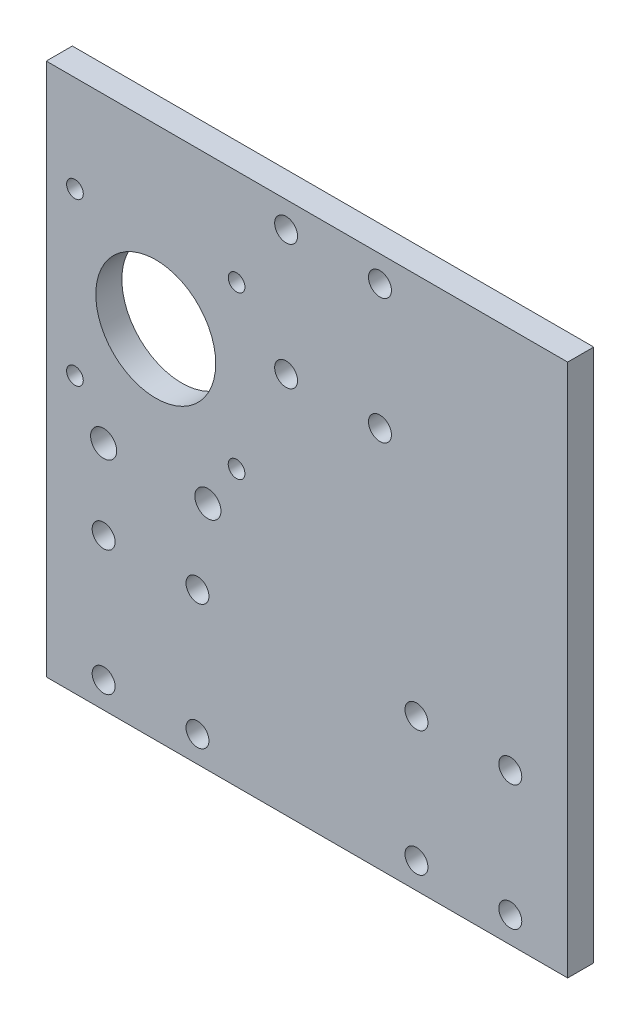
ISO-10303-21;
HEADER;
FILE_DESCRIPTION(('STEP AP214'),'2;1');
FILE_NAME('part.step','',(''),(''),'','','');
FILE_SCHEMA(('AUTOMOTIVE_DESIGN { 1 0 10303 214 1 1 1 1 }'));
ENDSEC;
DATA;
#1=APPLICATION_CONTEXT('core data for automotive mechanical design processes');
#2=APPLICATION_PROTOCOL_DEFINITION('international standard','automotive_design',2000,#1);
#3=PRODUCT_CONTEXT('',#1,'mechanical');
#4=PRODUCT('Part','Part','',(#3));
#5=PRODUCT_RELATED_PRODUCT_CATEGORY('part','',(#4));
#6=PRODUCT_DEFINITION_FORMATION('','',#4);
#7=PRODUCT_DEFINITION_CONTEXT('part definition',#1,'design');
#8=PRODUCT_DEFINITION('design','',#6,#7);
#9=PRODUCT_DEFINITION_SHAPE('','',#8);
#10=(LENGTH_UNIT() NAMED_UNIT(*) SI_UNIT(.MILLI.,.METRE.));
#11=(NAMED_UNIT(*) PLANE_ANGLE_UNIT() SI_UNIT($,.RADIAN.));
#12=(NAMED_UNIT(*) SI_UNIT($,.STERADIAN.) SOLID_ANGLE_UNIT());
#13=UNCERTAINTY_MEASURE_WITH_UNIT(LENGTH_MEASURE(1.E-05),#10,'distance_accuracy_value','');
#14=(GEOMETRIC_REPRESENTATION_CONTEXT(3) GLOBAL_UNCERTAINTY_ASSIGNED_CONTEXT((#13)) GLOBAL_UNIT_ASSIGNED_CONTEXT((#10,
#11,#12)) REPRESENTATION_CONTEXT('',''));
#15=CARTESIAN_POINT('',(0.,0.,0.));
#16=DIRECTION('',(0.,0.,1.));
#17=DIRECTION('',(1.,0.,0.));
#18=AXIS2_PLACEMENT_3D('',#15,#16,#17);
#19=CARTESIAN_POINT('',(50.,51.15,5.));
#20=DIRECTION('',(-1.,0.,0.));
#21=DIRECTION('',(0.,-1.,0.));
#22=AXIS2_PLACEMENT_3D('',#19,#20,#21);
#23=PLANE('',#22);
#24=DIRECTION('',(0.,1.,0.));
#25=VECTOR('',#24,1.);
#26=CARTESIAN_POINT('',(50.,51.15,0.));
#27=LINE('',#26,#25);
#28=CARTESIAN_POINT('',(50.,-51.15,0.));
#29=VERTEX_POINT('',#28);
#30=CARTESIAN_POINT('',(50.,51.15,0.));
#31=VERTEX_POINT('',#30);
#32=EDGE_CURVE('E101',#29,#31,#27,.T.);
#33=ORIENTED_EDGE('',*,*,#32,.T.);
#34=DIRECTION('',(0.,0.,-1.));
#35=VECTOR('',#34,1.);
#36=CARTESIAN_POINT('',(50.,51.15,5.));
#37=LINE('',#36,#35);
#38=CARTESIAN_POINT('',(50.,51.15,5.));
#39=VERTEX_POINT('',#38);
#40=EDGE_CURVE('E11',#39,#31,#37,.T.);
#41=ORIENTED_EDGE('',*,*,#40,.F.);
#42=DIRECTION('',(0.,1.,0.));
#43=VECTOR('',#42,1.);
#44=CARTESIAN_POINT('',(50.,51.15,5.));
#45=LINE('',#44,#43);
#46=CARTESIAN_POINT('',(50.,-51.15,5.));
#47=VERTEX_POINT('',#46);
#48=EDGE_CURVE('E88',#47,#39,#45,.T.);
#49=ORIENTED_EDGE('',*,*,#48,.F.);
#50=DIRECTION('',(0.,0.,-1.));
#51=VECTOR('',#50,1.);
#52=CARTESIAN_POINT('',(50.,-51.15,5.));
#53=LINE('',#52,#51);
#54=EDGE_CURVE('E97',#47,#29,#53,.T.);
#55=ORIENTED_EDGE('',*,*,#54,.T.);
#56=EDGE_LOOP('',(#33,#41,#49,#55));
#57=FACE_BOUND('',#56,.T.);
#58=ADVANCED_FACE('F35',(#57),#23,.F.);
#59=CARTESIAN_POINT('',(-50.,51.15,5.));
#60=DIRECTION('',(0.,-1.,0.));
#61=DIRECTION('',(0.,0.,-1.));
#62=AXIS2_PLACEMENT_3D('',#59,#60,#61);
#63=PLANE('',#62);
#64=DIRECTION('',(-1.,0.,0.));
#65=VECTOR('',#64,1.);
#66=CARTESIAN_POINT('',(-50.,51.15,0.));
#67=LINE('',#66,#65);
#68=CARTESIAN_POINT('',(-50.,51.15,0.));
#69=VERTEX_POINT('',#68);
#70=EDGE_CURVE('E92',#31,#69,#67,.T.);
#71=ORIENTED_EDGE('',*,*,#70,.T.);
#72=DIRECTION('',(0.,0.,-1.));
#73=VECTOR('',#72,1.);
#74=CARTESIAN_POINT('',(-50.,51.15,5.));
#75=LINE('',#74,#73);
#76=CARTESIAN_POINT('',(-50.,51.15,5.));
#77=VERTEX_POINT('',#76);
#78=EDGE_CURVE('E44',#77,#69,#75,.T.);
#79=ORIENTED_EDGE('',*,*,#78,.F.);
#80=DIRECTION('',(-1.,0.,0.));
#81=VECTOR('',#80,1.);
#82=CARTESIAN_POINT('',(-50.,51.15,5.));
#83=LINE('',#82,#81);
#84=EDGE_CURVE('E83',#39,#77,#83,.T.);
#85=ORIENTED_EDGE('',*,*,#84,.F.);
#86=ORIENTED_EDGE('',*,*,#40,.T.);
#87=EDGE_LOOP('',(#71,#79,#85,#86));
#88=FACE_BOUND('',#87,.T.);
#89=ADVANCED_FACE('F91',(#88),#63,.F.);
#90=CARTESIAN_POINT('',(-50.,51.15,5.));
#91=DIRECTION('',(1.,0.,0.));
#92=DIRECTION('',(0.,1.,0.));
#93=AXIS2_PLACEMENT_3D('',#90,#91,#92);
#94=PLANE('',#93);
#95=DIRECTION('',(0.,-1.,0.));
#96=VECTOR('',#95,1.);
#97=CARTESIAN_POINT('',(-50.,51.15,0.));
#98=LINE('',#97,#96);
#99=CARTESIAN_POINT('',(-50.,-51.15,0.));
#100=VERTEX_POINT('',#99);
#101=EDGE_CURVE('E70',#69,#100,#98,.T.);
#102=ORIENTED_EDGE('',*,*,#101,.T.);
#103=DIRECTION('',(0.,0.,-1.));
#104=VECTOR('',#103,1.);
#105=CARTESIAN_POINT('',(-50.,-51.15,5.));
#106=LINE('',#105,#104);
#107=CARTESIAN_POINT('',(-50.,-51.15,5.));
#108=VERTEX_POINT('',#107);
#109=EDGE_CURVE('E93',#108,#100,#106,.T.);
#110=ORIENTED_EDGE('',*,*,#109,.F.);
#111=DIRECTION('',(0.,-1.,0.));
#112=VECTOR('',#111,1.);
#113=CARTESIAN_POINT('',(-50.,51.15,5.));
#114=LINE('',#113,#112);
#115=EDGE_CURVE('E86',#77,#108,#114,.T.);
#116=ORIENTED_EDGE('',*,*,#115,.F.);
#117=ORIENTED_EDGE('',*,*,#78,.T.);
#118=EDGE_LOOP('',(#102,#110,#116,#117));
#119=FACE_BOUND('',#118,.T.);
#120=ADVANCED_FACE('F95',(#119),#94,.F.);
#121=CARTESIAN_POINT('',(-50.,-51.15,5.));
#122=DIRECTION('',(0.,1.,0.));
#123=DIRECTION('',(0.,0.,1.));
#124=AXIS2_PLACEMENT_3D('',#121,#122,#123);
#125=PLANE('',#124);
#126=DIRECTION('',(1.,0.,0.));
#127=VECTOR('',#126,1.);
#128=CARTESIAN_POINT('',(-50.,-51.15,0.));
#129=LINE('',#128,#127);
#130=EDGE_CURVE('E76',#100,#29,#129,.T.);
#131=ORIENTED_EDGE('',*,*,#130,.T.);
#132=ORIENTED_EDGE('',*,*,#54,.F.);
#133=DIRECTION('',(1.,0.,0.));
#134=VECTOR('',#133,1.);
#135=CARTESIAN_POINT('',(-50.,-51.15,5.));
#136=LINE('',#135,#134);
#137=EDGE_CURVE('E53',#108,#47,#136,.T.);
#138=ORIENTED_EDGE('',*,*,#137,.F.);
#139=ORIENTED_EDGE('',*,*,#109,.T.);
#140=EDGE_LOOP('',(#131,#132,#138,#139));
#141=FACE_BOUND('',#140,.T.);
#142=ADVANCED_FACE('F229',(#141),#125,.F.);
#143=CARTESIAN_POINT('',(0.,0.,5.));
#144=DIRECTION('',(0.,0.,1.));
#145=DIRECTION('',(1.,0.,0.));
#146=AXIS2_PLACEMENT_3D('',#143,#144,#145);
#147=PLANE('',#146);
#148=CARTESIAN_POINT('',(-39.,-6.85,5.));
#149=DIRECTION('',(0.,0.,1.));
#150=DIRECTION('',(1.,0.,0.));
#151=AXIS2_PLACEMENT_3D('',#148,#149,#150);
#152=CIRCLE('',#151,2.5);
#153=CARTESIAN_POINT('',(-36.5,-6.85,5.));
#154=VERTEX_POINT('',#153);
#155=EDGE_CURVE('E142',#154,#154,#152,.T.);
#156=ORIENTED_EDGE('',*,*,#155,.F.);
#157=EDGE_LOOP('',(#156));
#158=FACE_BOUND('',#157,.T.);
#159=CARTESIAN_POINT('',(-19.,-6.85,5.));
#160=DIRECTION('',(0.,0.,1.));
#161=DIRECTION('',(1.,0.,0.));
#162=AXIS2_PLACEMENT_3D('',#159,#160,#161);
#163=CIRCLE('',#162,2.5);
#164=CARTESIAN_POINT('',(-16.5,-6.85,5.));
#165=VERTEX_POINT('',#164);
#166=EDGE_CURVE('E148',#165,#165,#163,.T.);
#167=ORIENTED_EDGE('',*,*,#166,.F.);
#168=EDGE_LOOP('',(#167));
#169=FACE_BOUND('',#168,.T.);
#170=CARTESIAN_POINT('',(14.,46.15,5.));
#171=DIRECTION('',(0.,0.,1.));
#172=DIRECTION('',(1.,0.,0.));
#173=AXIS2_PLACEMENT_3D('',#170,#171,#172);
#174=CIRCLE('',#173,2.2);
#175=CARTESIAN_POINT('',(16.2,46.15,5.));
#176=VERTEX_POINT('',#175);
#177=EDGE_CURVE('E158',#176,#176,#174,.T.);
#178=ORIENTED_EDGE('',*,*,#177,.F.);
#179=EDGE_LOOP('',(#178));
#180=FACE_BOUND('',#179,.T.);
#181=CARTESIAN_POINT('',(-3.99999999999998,22.15,5.));
#182=DIRECTION('',(0.,0.,1.));
#183=DIRECTION('',(1.,0.,0.));
#184=AXIS2_PLACEMENT_3D('',#181,#182,#183);
#185=CIRCLE('',#184,2.2);
#186=CARTESIAN_POINT('',(-1.79999999999998,22.15,5.));
#187=VERTEX_POINT('',#186);
#188=EDGE_CURVE('E157',#187,#187,#185,.T.);
#189=ORIENTED_EDGE('',*,*,#188,.F.);
#190=EDGE_LOOP('',(#189));
#191=FACE_BOUND('',#190,.T.);
#192=CARTESIAN_POINT('',(14.,22.15,5.));
#193=DIRECTION('',(0.,0.,1.));
#194=DIRECTION('',(1.,0.,0.));
#195=AXIS2_PLACEMENT_3D('',#192,#193,#194);
#196=CIRCLE('',#195,2.2);
#197=CARTESIAN_POINT('',(16.2,22.15,5.));
#198=VERTEX_POINT('',#197);
#199=EDGE_CURVE('E146',#198,#198,#196,.T.);
#200=ORIENTED_EDGE('',*,*,#199,.F.);
#201=EDGE_LOOP('',(#200));
#202=FACE_BOUND('',#201,.T.);
#203=CARTESIAN_POINT('',(-3.99999999999998,46.15,5.));
#204=DIRECTION('',(0.,0.,1.));
#205=DIRECTION('',(1.,0.,0.));
#206=AXIS2_PLACEMENT_3D('',#203,#204,#205);
#207=CIRCLE('',#206,2.2);
#208=CARTESIAN_POINT('',(-1.79999999999998,46.15,5.));
#209=VERTEX_POINT('',#208);
#210=EDGE_CURVE('E131',#209,#209,#207,.T.);
#211=ORIENTED_EDGE('',*,*,#210,.F.);
#212=EDGE_LOOP('',(#211));
#213=FACE_BOUND('',#212,.T.);
#214=CARTESIAN_POINT('',(-13.5,1.65,5.));
#215=DIRECTION('',(0.,0.,1.));
#216=DIRECTION('',(1.,0.,0.));
#217=AXIS2_PLACEMENT_3D('',#214,#215,#216);
#218=CIRCLE('',#217,1.6);
#219=CARTESIAN_POINT('',(-11.9,1.65,5.));
#220=VERTEX_POINT('',#219);
#221=EDGE_CURVE('E139',#220,#220,#218,.T.);
#222=ORIENTED_EDGE('',*,*,#221,.F.);
#223=EDGE_LOOP('',(#222));
#224=FACE_BOUND('',#223,.T.);
#225=CARTESIAN_POINT('',(-13.4996795202951,32.6509610016103,5.));
#226=DIRECTION('',(0.,0.,1.));
#227=DIRECTION('',(1.,0.,0.));
#228=AXIS2_PLACEMENT_3D('',#225,#226,#227);
#229=CIRCLE('',#228,1.6);
#230=CARTESIAN_POINT('',(-11.8996795202951,32.6509610016103,5.));
#231=VERTEX_POINT('',#230);
#232=EDGE_CURVE('E171',#231,#231,#229,.T.);
#233=ORIENTED_EDGE('',*,*,#232,.F.);
#234=EDGE_LOOP('',(#233));
#235=FACE_BOUND('',#234,.T.);
#236=CARTESIAN_POINT('',(-44.4996800107538,1.64967949380698,5.));
#237=DIRECTION('',(0.,0.,1.));
#238=DIRECTION('',(1.,0.,0.));
#239=AXIS2_PLACEMENT_3D('',#236,#237,#238);
#240=CIRCLE('',#239,1.6);
#241=CARTESIAN_POINT('',(-42.8996800107538,1.64967949380698,5.));
#242=VERTEX_POINT('',#241);
#243=EDGE_CURVE('E168',#242,#242,#240,.T.);
#244=ORIENTED_EDGE('',*,*,#243,.F.);
#245=EDGE_LOOP('',(#244));
#246=FACE_BOUND('',#245,.T.);
#247=CARTESIAN_POINT('',(-44.499679493807,32.649679493807,5.));
#248=DIRECTION('',(0.,0.,1.));
#249=DIRECTION('',(1.,0.,0.));
#250=AXIS2_PLACEMENT_3D('',#247,#248,#249);
#251=CIRCLE('',#250,1.6);
#252=CARTESIAN_POINT('',(-42.899679493807,32.649679493807,5.));
#253=VERTEX_POINT('',#252);
#254=EDGE_CURVE('E165',#253,#253,#251,.T.);
#255=ORIENTED_EDGE('',*,*,#254,.F.);
#256=EDGE_LOOP('',(#255));
#257=FACE_BOUND('',#256,.T.);
#258=CARTESIAN_POINT('',(-29.,17.15,5.));
#259=DIRECTION('',(0.,0.,1.));
#260=DIRECTION('',(1.,0.,0.));
#261=AXIS2_PLACEMENT_3D('',#258,#259,#260);
#262=CIRCLE('',#261,11.5);
#263=CARTESIAN_POINT('',(-17.5,17.15,5.));
#264=VERTEX_POINT('',#263);
#265=EDGE_CURVE('E114',#264,#264,#262,.T.);
#266=ORIENTED_EDGE('',*,*,#265,.F.);
#267=EDGE_LOOP('',(#266));
#268=FACE_BOUND('',#267,.T.);
#269=CARTESIAN_POINT('',(-39.,-22.15,5.));
#270=DIRECTION('',(0.,0.,1.));
#271=DIRECTION('',(1.,0.,0.));
#272=AXIS2_PLACEMENT_3D('',#269,#270,#271);
#273=CIRCLE('',#272,2.2);
#274=CARTESIAN_POINT('',(-36.8,-22.15,5.));
#275=VERTEX_POINT('',#274);
#276=EDGE_CURVE('E126',#275,#275,#273,.T.);
#277=ORIENTED_EDGE('',*,*,#276,.F.);
#278=EDGE_LOOP('',(#277));
#279=FACE_BOUND('',#278,.T.);
#280=CARTESIAN_POINT('',(-39.,-46.15,5.));
#281=DIRECTION('',(0.,0.,1.));
#282=DIRECTION('',(1.,0.,0.));
#283=AXIS2_PLACEMENT_3D('',#280,#281,#282);
#284=CIRCLE('',#283,2.2);
#285=CARTESIAN_POINT('',(-36.8,-46.15,5.));
#286=VERTEX_POINT('',#285);
#287=EDGE_CURVE('E188',#286,#286,#284,.T.);
#288=ORIENTED_EDGE('',*,*,#287,.F.);
#289=EDGE_LOOP('',(#288));
#290=FACE_BOUND('',#289,.T.);
#291=CARTESIAN_POINT('',(-21.,-46.15,5.));
#292=DIRECTION('',(0.,0.,1.));
#293=DIRECTION('',(1.,0.,0.));
#294=AXIS2_PLACEMENT_3D('',#291,#292,#293);
#295=CIRCLE('',#294,2.2);
#296=CARTESIAN_POINT('',(-18.8,-46.15,5.));
#297=VERTEX_POINT('',#296);
#298=EDGE_CURVE('E182',#297,#297,#295,.T.);
#299=ORIENTED_EDGE('',*,*,#298,.F.);
#300=EDGE_LOOP('',(#299));
#301=FACE_BOUND('',#300,.T.);
#302=CARTESIAN_POINT('',(-21.,-22.15,5.));
#303=DIRECTION('',(0.,0.,1.));
#304=DIRECTION('',(1.,0.,0.));
#305=AXIS2_PLACEMENT_3D('',#302,#303,#304);
#306=CIRCLE('',#305,2.2);
#307=CARTESIAN_POINT('',(-18.8,-22.15,5.));
#308=VERTEX_POINT('',#307);
#309=EDGE_CURVE('E181',#308,#308,#306,.T.);
#310=ORIENTED_EDGE('',*,*,#309,.F.);
#311=EDGE_LOOP('',(#310));
#312=FACE_BOUND('',#311,.T.);
#313=CARTESIAN_POINT('',(21.,-22.15,5.));
#314=DIRECTION('',(0.,0.,1.));
#315=DIRECTION('',(1.,0.,0.));
#316=AXIS2_PLACEMENT_3D('',#313,#314,#315);
#317=CIRCLE('',#316,2.2);
#318=CARTESIAN_POINT('',(23.2,-22.15,5.));
#319=VERTEX_POINT('',#318);
#320=EDGE_CURVE('E199',#319,#319,#317,.T.);
#321=ORIENTED_EDGE('',*,*,#320,.F.);
#322=EDGE_LOOP('',(#321));
#323=FACE_BOUND('',#322,.T.);
#324=CARTESIAN_POINT('',(21.,-46.15,5.));
#325=DIRECTION('',(0.,0.,1.));
#326=DIRECTION('',(1.,0.,0.));
#327=AXIS2_PLACEMENT_3D('',#324,#325,#326);
#328=CIRCLE('',#327,2.2);
#329=CARTESIAN_POINT('',(23.2,-46.15,5.));
#330=VERTEX_POINT('',#329);
#331=EDGE_CURVE('E212',#330,#330,#328,.T.);
#332=ORIENTED_EDGE('',*,*,#331,.F.);
#333=EDGE_LOOP('',(#332));
#334=FACE_BOUND('',#333,.T.);
#335=CARTESIAN_POINT('',(39.,-46.15,5.));
#336=DIRECTION('',(0.,0.,1.));
#337=DIRECTION('',(1.,0.,0.));
#338=AXIS2_PLACEMENT_3D('',#335,#336,#337);
#339=CIRCLE('',#338,2.2);
#340=CARTESIAN_POINT('',(41.2,-46.15,5.));
#341=VERTEX_POINT('',#340);
#342=EDGE_CURVE('E206',#341,#341,#339,.T.);
#343=ORIENTED_EDGE('',*,*,#342,.F.);
#344=EDGE_LOOP('',(#343));
#345=FACE_BOUND('',#344,.T.);
#346=CARTESIAN_POINT('',(39.,-22.15,5.));
#347=DIRECTION('',(0.,0.,1.));
#348=DIRECTION('',(1.,0.,0.));
#349=AXIS2_PLACEMENT_3D('',#346,#347,#348);
#350=CIRCLE('',#349,2.2);
#351=CARTESIAN_POINT('',(41.2,-22.15,5.));
#352=VERTEX_POINT('',#351);
#353=EDGE_CURVE('E205',#352,#352,#350,.T.);
#354=ORIENTED_EDGE('',*,*,#353,.F.);
#355=EDGE_LOOP('',(#354));
#356=FACE_BOUND('',#355,.T.);
#357=ORIENTED_EDGE('',*,*,#48,.T.);
#358=ORIENTED_EDGE('',*,*,#84,.T.);
#359=ORIENTED_EDGE('',*,*,#115,.T.);
#360=ORIENTED_EDGE('',*,*,#137,.T.);
#361=EDGE_LOOP('',(#357,#358,#359,#360));
#362=FACE_BOUND('',#361,.T.);
#363=ADVANCED_FACE('F84',(#158,#169,#180,#191,#202,#213,#224,#235,#246,#257,#268,#279,#290,#301,
#312,#323,#334,#345,#356,#362),#147,.T.);
#364=CARTESIAN_POINT('',(0.,0.,0.));
#365=DIRECTION('',(0.,0.,1.));
#366=DIRECTION('',(1.,0.,0.));
#367=AXIS2_PLACEMENT_3D('',#364,#365,#366);
#368=PLANE('',#367);
#369=CARTESIAN_POINT('',(-39.,-6.85,0.));
#370=DIRECTION('',(0.,0.,1.));
#371=DIRECTION('',(1.,0.,0.));
#372=AXIS2_PLACEMENT_3D('',#369,#370,#371);
#373=CIRCLE('',#372,2.5);
#374=CARTESIAN_POINT('',(-36.5,-6.85,0.));
#375=VERTEX_POINT('',#374);
#376=EDGE_CURVE('E38',#375,#375,#373,.T.);
#377=ORIENTED_EDGE('',*,*,#376,.T.);
#378=EDGE_LOOP('',(#377));
#379=FACE_BOUND('',#378,.T.);
#380=CARTESIAN_POINT('',(-19.,-6.85,0.));
#381=DIRECTION('',(0.,0.,1.));
#382=DIRECTION('',(1.,0.,0.));
#383=AXIS2_PLACEMENT_3D('',#380,#381,#382);
#384=CIRCLE('',#383,2.5);
#385=CARTESIAN_POINT('',(-16.5,-6.85,0.));
#386=VERTEX_POINT('',#385);
#387=EDGE_CURVE('E140',#386,#386,#384,.T.);
#388=ORIENTED_EDGE('',*,*,#387,.T.);
#389=EDGE_LOOP('',(#388));
#390=FACE_BOUND('',#389,.T.);
#391=CARTESIAN_POINT('',(14.,46.15,0.));
#392=DIRECTION('',(0.,0.,1.));
#393=DIRECTION('',(1.,0.,0.));
#394=AXIS2_PLACEMENT_3D('',#391,#392,#393);
#395=CIRCLE('',#394,2.2);
#396=CARTESIAN_POINT('',(16.2,46.15,0.));
#397=VERTEX_POINT('',#396);
#398=EDGE_CURVE('E137',#397,#397,#395,.T.);
#399=ORIENTED_EDGE('',*,*,#398,.T.);
#400=EDGE_LOOP('',(#399));
#401=FACE_BOUND('',#400,.T.);
#402=CARTESIAN_POINT('',(-3.99999999999998,22.15,0.));
#403=DIRECTION('',(0.,0.,1.));
#404=DIRECTION('',(1.,0.,0.));
#405=AXIS2_PLACEMENT_3D('',#402,#403,#404);
#406=CIRCLE('',#405,2.2);
#407=CARTESIAN_POINT('',(-1.79999999999998,22.15,0.));
#408=VERTEX_POINT('',#407);
#409=EDGE_CURVE('E134',#408,#408,#406,.T.);
#410=ORIENTED_EDGE('',*,*,#409,.T.);
#411=EDGE_LOOP('',(#410));
#412=FACE_BOUND('',#411,.T.);
#413=CARTESIAN_POINT('',(14.,22.15,0.));
#414=DIRECTION('',(0.,0.,1.));
#415=DIRECTION('',(1.,0.,0.));
#416=AXIS2_PLACEMENT_3D('',#413,#414,#415);
#417=CIRCLE('',#416,2.2);
#418=CARTESIAN_POINT('',(16.2,22.15,0.));
#419=VERTEX_POINT('',#418);
#420=EDGE_CURVE('E130',#419,#419,#417,.T.);
#421=ORIENTED_EDGE('',*,*,#420,.T.);
#422=EDGE_LOOP('',(#421));
#423=FACE_BOUND('',#422,.T.);
#424=CARTESIAN_POINT('',(-3.99999999999998,46.15,0.));
#425=DIRECTION('',(0.,0.,1.));
#426=DIRECTION('',(1.,0.,0.));
#427=AXIS2_PLACEMENT_3D('',#424,#425,#426);
#428=CIRCLE('',#427,2.2);
#429=CARTESIAN_POINT('',(-1.79999999999998,46.15,0.));
#430=VERTEX_POINT('',#429);
#431=EDGE_CURVE('E127',#430,#430,#428,.T.);
#432=ORIENTED_EDGE('',*,*,#431,.T.);
#433=EDGE_LOOP('',(#432));
#434=FACE_BOUND('',#433,.T.);
#435=CARTESIAN_POINT('',(-13.5,1.65,0.));
#436=DIRECTION('',(0.,0.,1.));
#437=DIRECTION('',(1.,0.,0.));
#438=AXIS2_PLACEMENT_3D('',#435,#436,#437);
#439=CIRCLE('',#438,1.6);
#440=CARTESIAN_POINT('',(-11.9,1.65,0.));
#441=VERTEX_POINT('',#440);
#442=EDGE_CURVE('E123',#441,#441,#439,.T.);
#443=ORIENTED_EDGE('',*,*,#442,.T.);
#444=EDGE_LOOP('',(#443));
#445=FACE_BOUND('',#444,.T.);
#446=CARTESIAN_POINT('',(-13.4996795202951,32.6509610016103,0.));
#447=DIRECTION('',(0.,0.,1.));
#448=DIRECTION('',(1.,0.,0.));
#449=AXIS2_PLACEMENT_3D('',#446,#447,#448);
#450=CIRCLE('',#449,1.6);
#451=CARTESIAN_POINT('',(-11.8996795202951,32.6509610016103,0.));
#452=VERTEX_POINT('',#451);
#453=EDGE_CURVE('E120',#452,#452,#450,.T.);
#454=ORIENTED_EDGE('',*,*,#453,.T.);
#455=EDGE_LOOP('',(#454));
#456=FACE_BOUND('',#455,.T.);
#457=CARTESIAN_POINT('',(-44.4996800107538,1.64967949380698,0.));
#458=DIRECTION('',(0.,0.,1.));
#459=DIRECTION('',(1.,0.,0.));
#460=AXIS2_PLACEMENT_3D('',#457,#458,#459);
#461=CIRCLE('',#460,1.6);
#462=CARTESIAN_POINT('',(-42.8996800107538,1.64967949380698,0.));
#463=VERTEX_POINT('',#462);
#464=EDGE_CURVE('E117',#463,#463,#461,.T.);
#465=ORIENTED_EDGE('',*,*,#464,.T.);
#466=EDGE_LOOP('',(#465));
#467=FACE_BOUND('',#466,.T.);
#468=CARTESIAN_POINT('',(-44.499679493807,32.649679493807,0.));
#469=DIRECTION('',(0.,0.,1.));
#470=DIRECTION('',(1.,0.,0.));
#471=AXIS2_PLACEMENT_3D('',#468,#469,#470);
#472=CIRCLE('',#471,1.6);
#473=CARTESIAN_POINT('',(-42.899679493807,32.649679493807,0.));
#474=VERTEX_POINT('',#473);
#475=EDGE_CURVE('E113',#474,#474,#472,.T.);
#476=ORIENTED_EDGE('',*,*,#475,.T.);
#477=EDGE_LOOP('',(#476));
#478=FACE_BOUND('',#477,.T.);
#479=CARTESIAN_POINT('',(-29.,17.15,0.));
#480=DIRECTION('',(0.,0.,1.));
#481=DIRECTION('',(1.,0.,0.));
#482=AXIS2_PLACEMENT_3D('',#479,#480,#481);
#483=CIRCLE('',#482,11.5);
#484=CARTESIAN_POINT('',(-17.5,17.15,0.));
#485=VERTEX_POINT('',#484);
#486=EDGE_CURVE('E110',#485,#485,#483,.T.);
#487=ORIENTED_EDGE('',*,*,#486,.T.);
#488=EDGE_LOOP('',(#487));
#489=FACE_BOUND('',#488,.T.);
#490=CARTESIAN_POINT('',(-39.,-22.15,0.));
#491=DIRECTION('',(0.,0.,1.));
#492=DIRECTION('',(1.,0.,0.));
#493=AXIS2_PLACEMENT_3D('',#490,#491,#492);
#494=CIRCLE('',#493,2.2);
#495=CARTESIAN_POINT('',(-36.8,-22.15,0.));
#496=VERTEX_POINT('',#495);
#497=EDGE_CURVE('E191',#496,#496,#494,.T.);
#498=ORIENTED_EDGE('',*,*,#497,.T.);
#499=EDGE_LOOP('',(#498));
#500=FACE_BOUND('',#499,.T.);
#501=CARTESIAN_POINT('',(-39.,-46.15,0.));
#502=DIRECTION('',(0.,0.,1.));
#503=DIRECTION('',(1.,0.,0.));
#504=AXIS2_PLACEMENT_3D('',#501,#502,#503);
#505=CIRCLE('',#504,2.2);
#506=CARTESIAN_POINT('',(-36.8,-46.15,0.));
#507=VERTEX_POINT('',#506);
#508=EDGE_CURVE('E185',#507,#507,#505,.T.);
#509=ORIENTED_EDGE('',*,*,#508,.T.);
#510=EDGE_LOOP('',(#509));
#511=FACE_BOUND('',#510,.T.);
#512=CARTESIAN_POINT('',(-21.,-46.15,0.));
#513=DIRECTION('',(0.,0.,1.));
#514=DIRECTION('',(1.,0.,0.));
#515=AXIS2_PLACEMENT_3D('',#512,#513,#514);
#516=CIRCLE('',#515,2.2);
#517=CARTESIAN_POINT('',(-18.8,-46.15,0.));
#518=VERTEX_POINT('',#517);
#519=EDGE_CURVE('E178',#518,#518,#516,.T.);
#520=ORIENTED_EDGE('',*,*,#519,.T.);
#521=EDGE_LOOP('',(#520));
#522=FACE_BOUND('',#521,.T.);
#523=CARTESIAN_POINT('',(-21.,-22.15,0.));
#524=DIRECTION('',(0.,0.,1.));
#525=DIRECTION('',(1.,0.,0.));
#526=AXIS2_PLACEMENT_3D('',#523,#524,#525);
#527=CIRCLE('',#526,2.2);
#528=CARTESIAN_POINT('',(-18.8,-22.15,0.));
#529=VERTEX_POINT('',#528);
#530=EDGE_CURVE('E196',#529,#529,#527,.T.);
#531=ORIENTED_EDGE('',*,*,#530,.T.);
#532=EDGE_LOOP('',(#531));
#533=FACE_BOUND('',#532,.T.);
#534=CARTESIAN_POINT('',(21.,-22.15,0.));
#535=DIRECTION('',(0.,0.,1.));
#536=DIRECTION('',(1.,0.,0.));
#537=AXIS2_PLACEMENT_3D('',#534,#535,#536);
#538=CIRCLE('',#537,2.2);
#539=CARTESIAN_POINT('',(23.2,-22.15,0.));
#540=VERTEX_POINT('',#539);
#541=EDGE_CURVE('E215',#540,#540,#538,.T.);
#542=ORIENTED_EDGE('',*,*,#541,.T.);
#543=EDGE_LOOP('',(#542));
#544=FACE_BOUND('',#543,.T.);
#545=CARTESIAN_POINT('',(21.,-46.15,0.));
#546=DIRECTION('',(0.,0.,1.));
#547=DIRECTION('',(1.,0.,0.));
#548=AXIS2_PLACEMENT_3D('',#545,#546,#547);
#549=CIRCLE('',#548,2.2);
#550=CARTESIAN_POINT('',(23.2,-46.15,0.));
#551=VERTEX_POINT('',#550);
#552=EDGE_CURVE('E209',#551,#551,#549,.T.);
#553=ORIENTED_EDGE('',*,*,#552,.T.);
#554=EDGE_LOOP('',(#553));
#555=FACE_BOUND('',#554,.T.);
#556=CARTESIAN_POINT('',(39.,-46.15,0.));
#557=DIRECTION('',(0.,0.,1.));
#558=DIRECTION('',(1.,0.,0.));
#559=AXIS2_PLACEMENT_3D('',#556,#557,#558);
#560=CIRCLE('',#559,2.2);
#561=CARTESIAN_POINT('',(41.2,-46.15,0.));
#562=VERTEX_POINT('',#561);
#563=EDGE_CURVE('E202',#562,#562,#560,.T.);
#564=ORIENTED_EDGE('',*,*,#563,.T.);
#565=EDGE_LOOP('',(#564));
#566=FACE_BOUND('',#565,.T.);
#567=CARTESIAN_POINT('',(39.,-22.15,0.));
#568=DIRECTION('',(0.,0.,1.));
#569=DIRECTION('',(1.,0.,0.));
#570=AXIS2_PLACEMENT_3D('',#567,#568,#569);
#571=CIRCLE('',#570,2.2);
#572=CARTESIAN_POINT('',(41.2,-22.15,0.));
#573=VERTEX_POINT('',#572);
#574=EDGE_CURVE('E104',#573,#573,#571,.T.);
#575=ORIENTED_EDGE('',*,*,#574,.T.);
#576=EDGE_LOOP('',(#575));
#577=FACE_BOUND('',#576,.T.);
#578=ORIENTED_EDGE('',*,*,#32,.F.);
#579=ORIENTED_EDGE('',*,*,#130,.F.);
#580=ORIENTED_EDGE('',*,*,#101,.F.);
#581=ORIENTED_EDGE('',*,*,#70,.F.);
#582=EDGE_LOOP('',(#578,#579,#580,#581));
#583=FACE_BOUND('',#582,.T.);
#584=ADVANCED_FACE('F228',(#379,#390,#401,#412,#423,#434,#445,#456,#467,#478,#489,#500,#511,
#522,#533,#544,#555,#566,#577,#583),#368,.F.);
#585=CARTESIAN_POINT('',(39.,-22.15,0.));
#586=DIRECTION('',(0.,0.,1.));
#587=DIRECTION('',(1.,0.,0.));
#588=AXIS2_PLACEMENT_3D('',#585,#586,#587);
#589=CYLINDRICAL_SURFACE('',#588,2.2);
#590=ORIENTED_EDGE('',*,*,#574,.F.);
#591=EDGE_LOOP('',(#590));
#592=FACE_BOUND('',#591,.T.);
#593=ORIENTED_EDGE('',*,*,#353,.T.);
#594=EDGE_LOOP('',(#593));
#595=FACE_BOUND('',#594,.T.);
#596=ADVANCED_FACE('F225',(#592,#595),#589,.F.);
#597=CARTESIAN_POINT('',(39.,-46.15,0.));
#598=DIRECTION('',(0.,0.,1.));
#599=DIRECTION('',(1.,0.,0.));
#600=AXIS2_PLACEMENT_3D('',#597,#598,#599);
#601=CYLINDRICAL_SURFACE('',#600,2.2);
#602=ORIENTED_EDGE('',*,*,#563,.F.);
#603=EDGE_LOOP('',(#602));
#604=FACE_BOUND('',#603,.T.);
#605=ORIENTED_EDGE('',*,*,#342,.T.);
#606=EDGE_LOOP('',(#605));
#607=FACE_BOUND('',#606,.T.);
#608=ADVANCED_FACE('F268',(#604,#607),#601,.F.);
#609=CARTESIAN_POINT('',(21.,-46.15,0.));
#610=DIRECTION('',(0.,0.,1.));
#611=DIRECTION('',(1.,0.,0.));
#612=AXIS2_PLACEMENT_3D('',#609,#610,#611);
#613=CYLINDRICAL_SURFACE('',#612,2.2);
#614=ORIENTED_EDGE('',*,*,#552,.F.);
#615=EDGE_LOOP('',(#614));
#616=FACE_BOUND('',#615,.T.);
#617=ORIENTED_EDGE('',*,*,#331,.T.);
#618=EDGE_LOOP('',(#617));
#619=FACE_BOUND('',#618,.T.);
#620=ADVANCED_FACE('F278',(#616,#619),#613,.F.);
#621=CARTESIAN_POINT('',(21.,-22.15,0.));
#622=DIRECTION('',(0.,0.,1.));
#623=DIRECTION('',(1.,0.,0.));
#624=AXIS2_PLACEMENT_3D('',#621,#622,#623);
#625=CYLINDRICAL_SURFACE('',#624,2.2);
#626=ORIENTED_EDGE('',*,*,#541,.F.);
#627=EDGE_LOOP('',(#626));
#628=FACE_BOUND('',#627,.T.);
#629=ORIENTED_EDGE('',*,*,#320,.T.);
#630=EDGE_LOOP('',(#629));
#631=FACE_BOUND('',#630,.T.);
#632=ADVANCED_FACE('F288',(#628,#631),#625,.F.);
#633=CARTESIAN_POINT('',(-21.,-22.15,0.));
#634=DIRECTION('',(0.,0.,1.));
#635=DIRECTION('',(1.,0.,0.));
#636=AXIS2_PLACEMENT_3D('',#633,#634,#635);
#637=CYLINDRICAL_SURFACE('',#636,2.2);
#638=ORIENTED_EDGE('',*,*,#530,.F.);
#639=EDGE_LOOP('',(#638));
#640=FACE_BOUND('',#639,.T.);
#641=ORIENTED_EDGE('',*,*,#309,.T.);
#642=EDGE_LOOP('',(#641));
#643=FACE_BOUND('',#642,.T.);
#644=ADVANCED_FACE('F298',(#640,#643),#637,.F.);
#645=CARTESIAN_POINT('',(-21.,-46.15,0.));
#646=DIRECTION('',(0.,0.,1.));
#647=DIRECTION('',(1.,0.,0.));
#648=AXIS2_PLACEMENT_3D('',#645,#646,#647);
#649=CYLINDRICAL_SURFACE('',#648,2.2);
#650=ORIENTED_EDGE('',*,*,#519,.F.);
#651=EDGE_LOOP('',(#650));
#652=FACE_BOUND('',#651,.T.);
#653=ORIENTED_EDGE('',*,*,#298,.T.);
#654=EDGE_LOOP('',(#653));
#655=FACE_BOUND('',#654,.T.);
#656=ADVANCED_FACE('F308',(#652,#655),#649,.F.);
#657=CARTESIAN_POINT('',(-39.,-46.15,0.));
#658=DIRECTION('',(0.,0.,1.));
#659=DIRECTION('',(1.,0.,0.));
#660=AXIS2_PLACEMENT_3D('',#657,#658,#659);
#661=CYLINDRICAL_SURFACE('',#660,2.2);
#662=ORIENTED_EDGE('',*,*,#508,.F.);
#663=EDGE_LOOP('',(#662));
#664=FACE_BOUND('',#663,.T.);
#665=ORIENTED_EDGE('',*,*,#287,.T.);
#666=EDGE_LOOP('',(#665));
#667=FACE_BOUND('',#666,.T.);
#668=ADVANCED_FACE('F318',(#664,#667),#661,.F.);
#669=CARTESIAN_POINT('',(-39.,-22.15,0.));
#670=DIRECTION('',(0.,0.,1.));
#671=DIRECTION('',(1.,0.,0.));
#672=AXIS2_PLACEMENT_3D('',#669,#670,#671);
#673=CYLINDRICAL_SURFACE('',#672,2.2);
#674=ORIENTED_EDGE('',*,*,#497,.F.);
#675=EDGE_LOOP('',(#674));
#676=FACE_BOUND('',#675,.T.);
#677=ORIENTED_EDGE('',*,*,#276,.T.);
#678=EDGE_LOOP('',(#677));
#679=FACE_BOUND('',#678,.T.);
#680=ADVANCED_FACE('F328',(#676,#679),#673,.F.);
#681=CARTESIAN_POINT('',(-29.,17.15,-5.));
#682=DIRECTION('',(0.,0.,1.));
#683=DIRECTION('',(1.,0.,0.));
#684=AXIS2_PLACEMENT_3D('',#681,#682,#683);
#685=CYLINDRICAL_SURFACE('',#684,11.5);
#686=ORIENTED_EDGE('',*,*,#265,.T.);
#687=EDGE_LOOP('',(#686));
#688=FACE_BOUND('',#687,.T.);
#689=ORIENTED_EDGE('',*,*,#486,.F.);
#690=EDGE_LOOP('',(#689));
#691=FACE_BOUND('',#690,.T.);
#692=ADVANCED_FACE('F338',(#688,#691),#685,.F.);
#693=CARTESIAN_POINT('',(-44.499679493807,32.649679493807,-5.));
#694=DIRECTION('',(0.,0.,1.));
#695=DIRECTION('',(1.,0.,0.));
#696=AXIS2_PLACEMENT_3D('',#693,#694,#695);
#697=CYLINDRICAL_SURFACE('',#696,1.6);
#698=ORIENTED_EDGE('',*,*,#254,.T.);
#699=EDGE_LOOP('',(#698));
#700=FACE_BOUND('',#699,.T.);
#701=ORIENTED_EDGE('',*,*,#475,.F.);
#702=EDGE_LOOP('',(#701));
#703=FACE_BOUND('',#702,.T.);
#704=ADVANCED_FACE('F348',(#700,#703),#697,.F.);
#705=CARTESIAN_POINT('',(-44.4996800107538,1.64967949380698,-5.));
#706=DIRECTION('',(0.,0.,1.));
#707=DIRECTION('',(1.,0.,0.));
#708=AXIS2_PLACEMENT_3D('',#705,#706,#707);
#709=CYLINDRICAL_SURFACE('',#708,1.6);
#710=ORIENTED_EDGE('',*,*,#243,.T.);
#711=EDGE_LOOP('',(#710));
#712=FACE_BOUND('',#711,.T.);
#713=ORIENTED_EDGE('',*,*,#464,.F.);
#714=EDGE_LOOP('',(#713));
#715=FACE_BOUND('',#714,.T.);
#716=ADVANCED_FACE('F358',(#712,#715),#709,.F.);
#717=CARTESIAN_POINT('',(-13.4996795202951,32.6509610016103,-5.));
#718=DIRECTION('',(0.,0.,1.));
#719=DIRECTION('',(1.,0.,0.));
#720=AXIS2_PLACEMENT_3D('',#717,#718,#719);
#721=CYLINDRICAL_SURFACE('',#720,1.6);
#722=ORIENTED_EDGE('',*,*,#232,.T.);
#723=EDGE_LOOP('',(#722));
#724=FACE_BOUND('',#723,.T.);
#725=ORIENTED_EDGE('',*,*,#453,.F.);
#726=EDGE_LOOP('',(#725));
#727=FACE_BOUND('',#726,.T.);
#728=ADVANCED_FACE('F368',(#724,#727),#721,.F.);
#729=CARTESIAN_POINT('',(-13.5,1.65,-5.));
#730=DIRECTION('',(0.,0.,1.));
#731=DIRECTION('',(1.,0.,0.));
#732=AXIS2_PLACEMENT_3D('',#729,#730,#731);
#733=CYLINDRICAL_SURFACE('',#732,1.6);
#734=ORIENTED_EDGE('',*,*,#221,.T.);
#735=EDGE_LOOP('',(#734));
#736=FACE_BOUND('',#735,.T.);
#737=ORIENTED_EDGE('',*,*,#442,.F.);
#738=EDGE_LOOP('',(#737));
#739=FACE_BOUND('',#738,.T.);
#740=ADVANCED_FACE('F378',(#736,#739),#733,.F.);
#741=CARTESIAN_POINT('',(-3.99999999999998,46.15,-5.));
#742=DIRECTION('',(0.,0.,1.));
#743=DIRECTION('',(1.,0.,0.));
#744=AXIS2_PLACEMENT_3D('',#741,#742,#743);
#745=CYLINDRICAL_SURFACE('',#744,2.2);
#746=ORIENTED_EDGE('',*,*,#210,.T.);
#747=EDGE_LOOP('',(#746));
#748=FACE_BOUND('',#747,.T.);
#749=ORIENTED_EDGE('',*,*,#431,.F.);
#750=EDGE_LOOP('',(#749));
#751=FACE_BOUND('',#750,.T.);
#752=ADVANCED_FACE('F388',(#748,#751),#745,.F.);
#753=CARTESIAN_POINT('',(14.,22.15,-5.));
#754=DIRECTION('',(0.,0.,1.));
#755=DIRECTION('',(1.,0.,0.));
#756=AXIS2_PLACEMENT_3D('',#753,#754,#755);
#757=CYLINDRICAL_SURFACE('',#756,2.2);
#758=ORIENTED_EDGE('',*,*,#199,.T.);
#759=EDGE_LOOP('',(#758));
#760=FACE_BOUND('',#759,.T.);
#761=ORIENTED_EDGE('',*,*,#420,.F.);
#762=EDGE_LOOP('',(#761));
#763=FACE_BOUND('',#762,.T.);
#764=ADVANCED_FACE('F398',(#760,#763),#757,.F.);
#765=CARTESIAN_POINT('',(-3.99999999999998,22.15,-5.));
#766=DIRECTION('',(0.,0.,1.));
#767=DIRECTION('',(1.,0.,0.));
#768=AXIS2_PLACEMENT_3D('',#765,#766,#767);
#769=CYLINDRICAL_SURFACE('',#768,2.2);
#770=ORIENTED_EDGE('',*,*,#188,.T.);
#771=EDGE_LOOP('',(#770));
#772=FACE_BOUND('',#771,.T.);
#773=ORIENTED_EDGE('',*,*,#409,.F.);
#774=EDGE_LOOP('',(#773));
#775=FACE_BOUND('',#774,.T.);
#776=ADVANCED_FACE('F408',(#772,#775),#769,.F.);
#777=CARTESIAN_POINT('',(14.,46.15,-5.));
#778=DIRECTION('',(0.,0.,1.));
#779=DIRECTION('',(1.,0.,0.));
#780=AXIS2_PLACEMENT_3D('',#777,#778,#779);
#781=CYLINDRICAL_SURFACE('',#780,2.2);
#782=ORIENTED_EDGE('',*,*,#177,.T.);
#783=EDGE_LOOP('',(#782));
#784=FACE_BOUND('',#783,.T.);
#785=ORIENTED_EDGE('',*,*,#398,.F.);
#786=EDGE_LOOP('',(#785));
#787=FACE_BOUND('',#786,.T.);
#788=ADVANCED_FACE('F418',(#784,#787),#781,.F.);
#789=CARTESIAN_POINT('',(-19.,-6.85,-5.));
#790=DIRECTION('',(0.,0.,1.));
#791=DIRECTION('',(1.,0.,0.));
#792=AXIS2_PLACEMENT_3D('',#789,#790,#791);
#793=CYLINDRICAL_SURFACE('',#792,2.5);
#794=ORIENTED_EDGE('',*,*,#166,.T.);
#795=EDGE_LOOP('',(#794));
#796=FACE_BOUND('',#795,.T.);
#797=ORIENTED_EDGE('',*,*,#387,.F.);
#798=EDGE_LOOP('',(#797));
#799=FACE_BOUND('',#798,.T.);
#800=ADVANCED_FACE('F427',(#796,#799),#793,.F.);
#801=CARTESIAN_POINT('',(-39.,-6.85,-5.));
#802=DIRECTION('',(0.,0.,1.));
#803=DIRECTION('',(1.,0.,0.));
#804=AXIS2_PLACEMENT_3D('',#801,#802,#803);
#805=CYLINDRICAL_SURFACE('',#804,2.5);
#806=ORIENTED_EDGE('',*,*,#155,.T.);
#807=EDGE_LOOP('',(#806));
#808=FACE_BOUND('',#807,.T.);
#809=ORIENTED_EDGE('',*,*,#376,.F.);
#810=EDGE_LOOP('',(#809));
#811=FACE_BOUND('',#810,.T.);
#812=ADVANCED_FACE('F446',(#808,#811),#805,.F.);
#813=CLOSED_SHELL('',(#58,#89,#120,#142,#363,#584,#596,#608,#620,#632,#644,#656,#668,#680,#692,
#704,#716,#728,#740,#752,#764,#776,#788,#800,#812));
#814=MANIFOLD_SOLID_BREP('B2',#813);
#815=ADVANCED_BREP_SHAPE_REPRESENTATION('',(#18,#814),#14);
#816=SHAPE_DEFINITION_REPRESENTATION(#9,#815);
ENDSEC;
END-ISO-10303-21;
